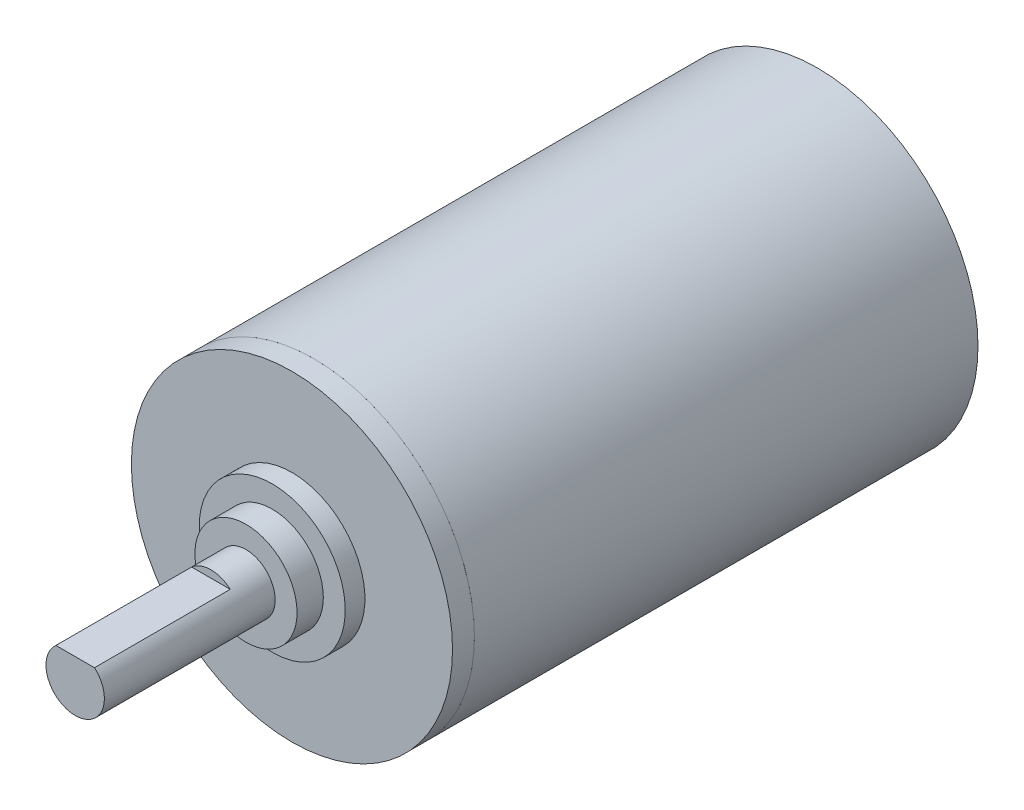
ISO-10303-21;
HEADER;
FILE_DESCRIPTION(('STEP AP214'),'2;1');
FILE_NAME('part.step','',(''),(''),'','','');
FILE_SCHEMA(('AUTOMOTIVE_DESIGN { 1 0 10303 214 1 1 1 1 }'));
ENDSEC;
DATA;
#1=APPLICATION_CONTEXT('core data for automotive mechanical design processes');
#2=APPLICATION_PROTOCOL_DEFINITION('international standard','automotive_design',2000,#1);
#3=PRODUCT_CONTEXT('',#1,'mechanical');
#4=PRODUCT('Part','Part','',(#3));
#5=PRODUCT_RELATED_PRODUCT_CATEGORY('part','',(#4));
#6=PRODUCT_DEFINITION_FORMATION('','',#4);
#7=PRODUCT_DEFINITION_CONTEXT('part definition',#1,'design');
#8=PRODUCT_DEFINITION('design','',#6,#7);
#9=PRODUCT_DEFINITION_SHAPE('','',#8);
#10=(LENGTH_UNIT() NAMED_UNIT(*) SI_UNIT(.MILLI.,.METRE.));
#11=(NAMED_UNIT(*) PLANE_ANGLE_UNIT() SI_UNIT($,.RADIAN.));
#12=(NAMED_UNIT(*) SI_UNIT($,.STERADIAN.) SOLID_ANGLE_UNIT());
#13=UNCERTAINTY_MEASURE_WITH_UNIT(LENGTH_MEASURE(1.E-05),#10,'distance_accuracy_value','');
#14=(GEOMETRIC_REPRESENTATION_CONTEXT(3) GLOBAL_UNCERTAINTY_ASSIGNED_CONTEXT((#13)) GLOBAL_UNIT_ASSIGNED_CONTEXT((#10,
#11,#12)) REPRESENTATION_CONTEXT('',''));
#15=CARTESIAN_POINT('',(0.,0.,0.));
#16=DIRECTION('',(0.,0.,1.));
#17=DIRECTION('',(1.,0.,0.));
#18=AXIS2_PLACEMENT_3D('',#15,#16,#17);
#19=CARTESIAN_POINT('',(0.,0.,14.85));
#20=DIRECTION('',(0.,0.,-1.));
#21=DIRECTION('',(-1.,0.,0.));
#22=AXIS2_PLACEMENT_3D('',#19,#20,#21);
#23=CYLINDRICAL_SURFACE('',#22,2.);
#24=CARTESIAN_POINT('',(0.,0.,3.15));
#25=DIRECTION('',(0.,0.,1.));
#26=DIRECTION('',(1.,0.,0.));
#27=AXIS2_PLACEMENT_3D('',#24,#25,#26);
#28=CIRCLE('',#27,2.);
#29=CARTESIAN_POINT('',(2.,0.,3.15));
#30=VERTEX_POINT('',#29);
#31=EDGE_CURVE('E89',#30,#30,#28,.T.);
#32=ORIENTED_EDGE('',*,*,#31,.T.);
#33=EDGE_LOOP('',(#32));
#34=FACE_BOUND('',#33,.T.);
#35=DIRECTION('',(0.,0.,1.));
#36=VECTOR('',#35,1.);
#37=CARTESIAN_POINT('',(1.3228756555323,1.5,5.55));
#38=LINE('',#37,#36);
#39=CARTESIAN_POINT('',(1.3228756555323,1.5,5.55));
#40=VERTEX_POINT('',#39);
#41=CARTESIAN_POINT('',(1.3228756555323,1.5,14.85));
#42=VERTEX_POINT('',#41);
#43=EDGE_CURVE('E64',#40,#42,#38,.T.);
#44=ORIENTED_EDGE('',*,*,#43,.T.);
#45=CARTESIAN_POINT('',(0.,0.,14.85));
#46=DIRECTION('',(0.,0.,1.));
#47=DIRECTION('',(1.,0.,0.));
#48=AXIS2_PLACEMENT_3D('',#45,#46,#47);
#49=CIRCLE('',#48,2.);
#50=CARTESIAN_POINT('',(-1.3228756555323,1.5,14.85));
#51=VERTEX_POINT('',#50);
#52=EDGE_CURVE('E72',#51,#42,#49,.T.);
#53=ORIENTED_EDGE('',*,*,#52,.F.);
#54=DIRECTION('',(0.,0.,1.));
#55=VECTOR('',#54,1.);
#56=CARTESIAN_POINT('',(-1.3228756555323,1.5,5.55));
#57=LINE('',#56,#55);
#58=CARTESIAN_POINT('',(-1.3228756555323,1.5,5.55));
#59=VERTEX_POINT('',#58);
#60=EDGE_CURVE('E51',#59,#51,#57,.T.);
#61=ORIENTED_EDGE('',*,*,#60,.F.);
#62=CARTESIAN_POINT('',(0.,0.,5.55));
#63=DIRECTION('',(0.,0.,1.));
#64=DIRECTION('',(1.,0.,0.));
#65=AXIS2_PLACEMENT_3D('',#62,#63,#64);
#66=CIRCLE('',#65,2.);
#67=EDGE_CURVE('E73',#40,#59,#66,.T.);
#68=ORIENTED_EDGE('',*,*,#67,.F.);
#69=EDGE_LOOP('',(#44,#53,#61,#68));
#70=FACE_BOUND('',#69,.T.);
#71=ADVANCED_FACE('F36',(#34,#70),#23,.T.);
#72=CARTESIAN_POINT('',(0.,-24.3414213562373,14.85));
#73=DIRECTION('',(0.,0.,1.));
#74=DIRECTION('',(1.,0.,0.));
#75=AXIS2_PLACEMENT_3D('',#72,#73,#74);
#76=PLANE('',#75);
#77=ORIENTED_EDGE('',*,*,#52,.T.);
#78=DIRECTION('',(-1.,0.,0.));
#79=VECTOR('',#78,1.);
#80=CARTESIAN_POINT('',(0.,1.5,14.85));
#81=LINE('',#80,#79);
#82=EDGE_CURVE('E61',#42,#51,#81,.T.);
#83=ORIENTED_EDGE('',*,*,#82,.T.);
#84=EDGE_LOOP('',(#77,#83));
#85=FACE_BOUND('',#84,.T.);
#86=ADVANCED_FACE('F75',(#85),#76,.T.);
#87=CARTESIAN_POINT('',(0.,-24.3414213562373,0.));
#88=DIRECTION('',(0.,0.,1.));
#89=DIRECTION('',(1.,0.,0.));
#90=AXIS2_PLACEMENT_3D('',#87,#88,#89);
#91=PLANE('',#90);
#92=CARTESIAN_POINT('',(0.,0.,0.));
#93=DIRECTION('',(0.,0.,1.));
#94=DIRECTION('',(1.,0.,0.));
#95=AXIS2_PLACEMENT_3D('',#92,#93,#94);
#96=CIRCLE('',#95,11.);
#97=CARTESIAN_POINT('',(11.,0.,0.));
#98=VERTEX_POINT('',#97);
#99=EDGE_CURVE('E40',#98,#98,#96,.T.);
#100=ORIENTED_EDGE('',*,*,#99,.T.);
#101=EDGE_LOOP('',(#100));
#102=FACE_BOUND('',#101,.T.);
#103=CARTESIAN_POINT('',(0.,0.,0.));
#104=DIRECTION('',(0.,0.,1.));
#105=DIRECTION('',(1.,0.,0.));
#106=AXIS2_PLACEMENT_3D('',#103,#104,#105);
#107=CIRCLE('',#106,5.);
#108=CARTESIAN_POINT('',(-5.,0.,0.));
#109=VERTEX_POINT('',#108);
#110=EDGE_CURVE('E97',#109,#109,#107,.T.);
#111=ORIENTED_EDGE('',*,*,#110,.F.);
#112=EDGE_LOOP('',(#111));
#113=FACE_BOUND('',#112,.T.);
#114=ADVANCED_FACE('F109',(#102,#113),#91,.T.);
#115=CARTESIAN_POINT('',(0.,0.,-36.));
#116=DIRECTION('',(0.,0.,1.));
#117=DIRECTION('',(1.,0.,0.));
#118=AXIS2_PLACEMENT_3D('',#115,#116,#117);
#119=CYLINDRICAL_SURFACE('',#118,11.);
#120=CARTESIAN_POINT('',(0.,0.,-1.5));
#121=DIRECTION('',(0.,0.,1.));
#122=DIRECTION('',(1.,0.,0.));
#123=AXIS2_PLACEMENT_3D('',#120,#121,#122);
#124=CIRCLE('',#123,11.);
#125=CARTESIAN_POINT('',(11.,0.,-1.5));
#126=VERTEX_POINT('',#125);
#127=EDGE_CURVE('E84',#126,#126,#124,.T.);
#128=ORIENTED_EDGE('',*,*,#127,.T.);
#129=EDGE_LOOP('',(#128));
#130=FACE_BOUND('',#129,.T.);
#131=ORIENTED_EDGE('',*,*,#99,.F.);
#132=EDGE_LOOP('',(#131));
#133=FACE_BOUND('',#132,.T.);
#134=ADVANCED_FACE('F38',(#130,#133),#119,.T.);
#135=CARTESIAN_POINT('',(0.,0.,1.35));
#136=DIRECTION('',(0.,0.,-1.));
#137=DIRECTION('',(-1.,0.,0.));
#138=AXIS2_PLACEMENT_3D('',#135,#136,#137);
#139=CYLINDRICAL_SURFACE('',#138,5.);
#140=CARTESIAN_POINT('',(0.,0.,1.35));
#141=DIRECTION('',(0.,0.,1.));
#142=DIRECTION('',(1.,0.,0.));
#143=AXIS2_PLACEMENT_3D('',#140,#141,#142);
#144=CIRCLE('',#143,5.);
#145=CARTESIAN_POINT('',(-5.,0.,1.35));
#146=VERTEX_POINT('',#145);
#147=EDGE_CURVE('E101',#146,#146,#144,.T.);
#148=CARTESIAN_POINT('',(-5.,0.,1.35));
#149=CARTESIAN_POINT('',(-5.,0.,1.3359375));
#150=CARTESIAN_POINT('',(-5.,0.,1.321875));
#151=CARTESIAN_POINT('',(-5.,0.,1.29375));
#152=CARTESIAN_POINT('',(-5.,0.,1.2796875));
#153=CARTESIAN_POINT('',(-5.,0.,1.2515625));
#154=CARTESIAN_POINT('',(-5.,0.,1.2375));
#155=CARTESIAN_POINT('',(-5.,0.,1.209375));
#156=CARTESIAN_POINT('',(-5.,0.,1.1953125));
#157=CARTESIAN_POINT('',(-5.,0.,1.1671875));
#158=CARTESIAN_POINT('',(-5.,0.,1.153125));
#159=CARTESIAN_POINT('',(-5.,0.,1.125));
#160=CARTESIAN_POINT('',(-5.,0.,1.1109375));
#161=CARTESIAN_POINT('',(-5.,0.,1.0828125));
#162=CARTESIAN_POINT('',(-5.,0.,1.06875));
#163=CARTESIAN_POINT('',(-5.,0.,1.040625));
#164=CARTESIAN_POINT('',(-5.,0.,1.0265625));
#165=CARTESIAN_POINT('',(-5.,0.,0.9984375));
#166=CARTESIAN_POINT('',(-5.,0.,0.984375));
#167=CARTESIAN_POINT('',(-5.,0.,0.95625));
#168=CARTESIAN_POINT('',(-5.,0.,0.9421875));
#169=CARTESIAN_POINT('',(-5.,0.,0.9140625));
#170=CARTESIAN_POINT('',(-5.,0.,0.9));
#171=CARTESIAN_POINT('',(-5.,0.,0.871875));
#172=CARTESIAN_POINT('',(-5.,0.,0.8578125));
#173=CARTESIAN_POINT('',(-5.,0.,0.8296875));
#174=CARTESIAN_POINT('',(-5.,0.,0.815625));
#175=CARTESIAN_POINT('',(-5.,0.,0.7875));
#176=CARTESIAN_POINT('',(-5.,0.,0.7734375));
#177=CARTESIAN_POINT('',(-5.,0.,0.7453125));
#178=CARTESIAN_POINT('',(-5.,0.,0.73125));
#179=CARTESIAN_POINT('',(-5.,0.,0.703125));
#180=CARTESIAN_POINT('',(-5.,0.,0.6890625));
#181=CARTESIAN_POINT('',(-5.,0.,0.6609375));
#182=CARTESIAN_POINT('',(-5.,0.,0.646875));
#183=CARTESIAN_POINT('',(-5.,0.,0.61875));
#184=CARTESIAN_POINT('',(-5.,0.,0.6046875));
#185=CARTESIAN_POINT('',(-5.,0.,0.5765625));
#186=CARTESIAN_POINT('',(-5.,0.,0.5625));
#187=CARTESIAN_POINT('',(-5.,0.,0.534375));
#188=CARTESIAN_POINT('',(-5.,0.,0.5203125));
#189=CARTESIAN_POINT('',(-5.,0.,0.4921875));
#190=CARTESIAN_POINT('',(-5.,0.,0.478125));
#191=CARTESIAN_POINT('',(-5.,0.,0.45));
#192=CARTESIAN_POINT('',(-5.,0.,0.4359375));
#193=CARTESIAN_POINT('',(-5.,0.,0.4078125));
#194=CARTESIAN_POINT('',(-5.,0.,0.39375));
#195=CARTESIAN_POINT('',(-5.,0.,0.365625));
#196=CARTESIAN_POINT('',(-5.,0.,0.3515625));
#197=CARTESIAN_POINT('',(-5.,0.,0.3234375));
#198=CARTESIAN_POINT('',(-5.,0.,0.309375));
#199=CARTESIAN_POINT('',(-5.,0.,0.28125));
#200=CARTESIAN_POINT('',(-5.,0.,0.2671875));
#201=CARTESIAN_POINT('',(-5.,0.,0.2390625));
#202=CARTESIAN_POINT('',(-5.,0.,0.225));
#203=CARTESIAN_POINT('',(-5.,0.,0.196875));
#204=CARTESIAN_POINT('',(-5.,0.,0.1828125));
#205=CARTESIAN_POINT('',(-5.,0.,0.1546875));
#206=CARTESIAN_POINT('',(-5.,0.,0.140625));
#207=CARTESIAN_POINT('',(-5.,0.,0.1125));
#208=CARTESIAN_POINT('',(-5.,0.,0.0984374999999998));
#209=CARTESIAN_POINT('',(-5.,0.,0.0703124999999998));
#210=CARTESIAN_POINT('',(-5.,0.,0.0562499999999999));
#211=CARTESIAN_POINT('',(-5.,0.,0.0281249999999999));
#212=CARTESIAN_POINT('',(-5.,0.,0.0140624999999998));
#213=CARTESIAN_POINT('',(-5.,0.,0.));
#214=B_SPLINE_CURVE_WITH_KNOTS('',3,(#148,#149,#150,#151,#152,#153,#154,#155,#156,#157,#158,
#159,#160,#161,#162,#163,#164,#165,#166,#167,#168,#169,#170,#171,#172,#173,#174,#175,#176,#177,
#178,#179,#180,#181,#182,#183,#184,#185,#186,#187,#188,#189,#190,#191,#192,#193,#194,#195,#196,
#197,#198,#199,#200,#201,#202,#203,#204,#205,#206,#207,#208,#209,#210,#211,#212,#213),
.UNSPECIFIED.,.F.,.F.,(4,2,2,2,2,2,2,2,2,2,2,2,2,2,2,2,2,2,2,2,2,2,2,2,2,2,2,2,2,2,2,2,4),(0.,
0.0421875000000001,0.084375,0.1265625,0.16875,0.2109375,0.253125,0.2953125,0.3375,0.3796875,
0.421875,0.4640625,0.50625,0.5484375,0.590625,0.6328125,0.675,0.7171875,0.759375,0.8015625,
0.84375,0.8859375,0.928125,0.9703125,1.0125,1.0546875,1.096875,1.1390625,1.18125,1.2234375,
1.265625,1.3078125,1.35),.UNSPECIFIED.);
#215=EDGE_CURVE('BSEAM107',#146,#109,#214,.T.);
#216=ORIENTED_EDGE('',*,*,#147,.F.);
#217=ORIENTED_EDGE('',*,*,#110,.T.);
#218=ORIENTED_EDGE('',*,*,#215,.T.);
#219=ORIENTED_EDGE('',*,*,#215,.F.);
#220=EDGE_LOOP('',(#216,#218,#217,#219));
#221=FACE_BOUND('',#220,.T.);
#222=ADVANCED_FACE('F107',(#221),#139,.T.);
#223=CARTESIAN_POINT('',(0.,-24.3414213562373,1.35));
#224=DIRECTION('',(0.,0.,1.));
#225=DIRECTION('',(1.,0.,0.));
#226=AXIS2_PLACEMENT_3D('',#223,#224,#225);
#227=PLANE('',#226);
#228=CARTESIAN_POINT('',(0.,0.,1.35));
#229=DIRECTION('',(0.,0.,1.));
#230=DIRECTION('',(1.,0.,0.));
#231=AXIS2_PLACEMENT_3D('',#228,#229,#230);
#232=CIRCLE('',#231,3.5);
#233=CARTESIAN_POINT('',(3.5,0.,1.35));
#234=VERTEX_POINT('',#233);
#235=EDGE_CURVE('E98',#234,#234,#232,.T.);
#236=ORIENTED_EDGE('',*,*,#235,.F.);
#237=EDGE_LOOP('',(#236));
#238=FACE_BOUND('',#237,.T.);
#239=ORIENTED_EDGE('',*,*,#147,.T.);
#240=EDGE_LOOP('',(#239));
#241=FACE_BOUND('',#240,.T.);
#242=ADVANCED_FACE('F148',(#238,#241),#227,.T.);
#243=CARTESIAN_POINT('',(0.,0.,3.15));
#244=DIRECTION('',(0.,0.,-1.));
#245=DIRECTION('',(-1.,0.,0.));
#246=AXIS2_PLACEMENT_3D('',#243,#244,#245);
#247=CYLINDRICAL_SURFACE('',#246,3.5);
#248=ORIENTED_EDGE('',*,*,#235,.T.);
#249=EDGE_LOOP('',(#248));
#250=FACE_BOUND('',#249,.T.);
#251=CARTESIAN_POINT('',(0.,0.,3.15));
#252=DIRECTION('',(0.,0.,1.));
#253=DIRECTION('',(1.,0.,0.));
#254=AXIS2_PLACEMENT_3D('',#251,#252,#253);
#255=CIRCLE('',#254,3.5);
#256=CARTESIAN_POINT('',(3.5,0.,3.15));
#257=VERTEX_POINT('',#256);
#258=EDGE_CURVE('E94',#257,#257,#255,.T.);
#259=ORIENTED_EDGE('',*,*,#258,.F.);
#260=EDGE_LOOP('',(#259));
#261=FACE_BOUND('',#260,.T.);
#262=ADVANCED_FACE('F144',(#250,#261),#247,.T.);
#263=CARTESIAN_POINT('',(0.,-24.3414213562373,3.15));
#264=DIRECTION('',(0.,0.,1.));
#265=DIRECTION('',(1.,0.,0.));
#266=AXIS2_PLACEMENT_3D('',#263,#264,#265);
#267=PLANE('',#266);
#268=ORIENTED_EDGE('',*,*,#31,.F.);
#269=EDGE_LOOP('',(#268));
#270=FACE_BOUND('',#269,.T.);
#271=ORIENTED_EDGE('',*,*,#258,.T.);
#272=EDGE_LOOP('',(#271));
#273=FACE_BOUND('',#272,.T.);
#274=ADVANCED_FACE('F137',(#270,#273),#267,.T.);
#275=CARTESIAN_POINT('',(0.,0.,-1.501));
#276=DIRECTION('',(0.,0.,1.));
#277=DIRECTION('',(1.,0.,0.));
#278=AXIS2_PLACEMENT_3D('',#275,#276,#277);
#279=PLANE('',#278);
#280=CARTESIAN_POINT('',(0.,0.,-1.501));
#281=DIRECTION('',(0.,0.,1.));
#282=DIRECTION('',(1.,0.,0.));
#283=AXIS2_PLACEMENT_3D('',#280,#281,#282);
#284=CIRCLE('',#283,10.5);
#285=CARTESIAN_POINT('',(10.5,0.,-1.501));
#286=VERTEX_POINT('',#285);
#287=EDGE_CURVE('E79',#286,#286,#284,.T.);
#288=ORIENTED_EDGE('',*,*,#287,.F.);
#289=EDGE_LOOP('',(#288));
#290=FACE_BOUND('',#289,.T.);
#291=CARTESIAN_POINT('',(0.,0.,-1.501));
#292=DIRECTION('',(0.,0.,1.));
#293=DIRECTION('',(1.,0.,0.));
#294=AXIS2_PLACEMENT_3D('',#291,#292,#293);
#295=CIRCLE('',#294,11.);
#296=CARTESIAN_POINT('',(11.,0.,-1.501));
#297=VERTEX_POINT('',#296);
#298=EDGE_CURVE('E86',#297,#297,#295,.T.);
#299=ORIENTED_EDGE('',*,*,#298,.T.);
#300=EDGE_LOOP('',(#299));
#301=FACE_BOUND('',#300,.T.);
#302=ADVANCED_FACE('F134',(#290,#301),#279,.T.);
#303=CARTESIAN_POINT('',(0.,0.,-1.5));
#304=DIRECTION('',(0.,0.,1.));
#305=DIRECTION('',(1.,0.,0.));
#306=AXIS2_PLACEMENT_3D('',#303,#304,#305);
#307=PLANE('',#306);
#308=CARTESIAN_POINT('',(0.,0.,-1.5));
#309=DIRECTION('',(0.,0.,1.));
#310=DIRECTION('',(1.,0.,0.));
#311=AXIS2_PLACEMENT_3D('',#308,#309,#310);
#312=CIRCLE('',#311,10.5);
#313=CARTESIAN_POINT('',(10.5,0.,-1.5));
#314=VERTEX_POINT('',#313);
#315=EDGE_CURVE('E76',#314,#314,#312,.T.);
#316=ORIENTED_EDGE('',*,*,#315,.T.);
#317=EDGE_LOOP('',(#316));
#318=FACE_BOUND('',#317,.T.);
#319=ORIENTED_EDGE('',*,*,#127,.F.);
#320=EDGE_LOOP('',(#319));
#321=FACE_BOUND('',#320,.T.);
#322=ADVANCED_FACE('F132',(#318,#321),#307,.F.);
#323=CARTESIAN_POINT('',(0.,0.,-1.501));
#324=DIRECTION('',(0.,0.,1.));
#325=DIRECTION('',(1.,0.,0.));
#326=AXIS2_PLACEMENT_3D('',#323,#324,#325);
#327=CYLINDRICAL_SURFACE('',#326,10.5);
#328=ORIENTED_EDGE('',*,*,#287,.T.);
#329=EDGE_LOOP('',(#328));
#330=FACE_BOUND('',#329,.T.);
#331=ORIENTED_EDGE('',*,*,#315,.F.);
#332=EDGE_LOOP('',(#331));
#333=FACE_BOUND('',#332,.T.);
#334=ADVANCED_FACE('F128',(#330,#333),#327,.T.);
#335=CARTESIAN_POINT('',(0.,-24.3414213562373,-36.));
#336=DIRECTION('',(0.,0.,1.));
#337=DIRECTION('',(1.,0.,0.));
#338=AXIS2_PLACEMENT_3D('',#335,#336,#337);
#339=PLANE('',#338);
#340=CARTESIAN_POINT('',(0.,0.,-36.));
#341=DIRECTION('',(0.,0.,-1.));
#342=DIRECTION('',(-1.,0.,0.));
#343=AXIS2_PLACEMENT_3D('',#340,#341,#342);
#344=CIRCLE('',#343,5.);
#345=CARTESIAN_POINT('',(-5.,0.,-36.));
#346=VERTEX_POINT('',#345);
#347=EDGE_CURVE('E164',#346,#346,#344,.T.);
#348=ORIENTED_EDGE('',*,*,#347,.F.);
#349=EDGE_LOOP('',(#348));
#350=FACE_BOUND('',#349,.T.);
#351=CARTESIAN_POINT('',(0.,0.,-36.));
#352=DIRECTION('',(0.,0.,1.));
#353=DIRECTION('',(1.,0.,0.));
#354=AXIS2_PLACEMENT_3D('',#351,#352,#353);
#355=CIRCLE('',#354,11.);
#356=CARTESIAN_POINT('',(11.,0.,-36.));
#357=VERTEX_POINT('',#356);
#358=EDGE_CURVE('E11',#357,#357,#355,.T.);
#359=ORIENTED_EDGE('',*,*,#358,.F.);
#360=EDGE_LOOP('',(#359));
#361=FACE_BOUND('',#360,.T.);
#362=ADVANCED_FACE('F131',(#350,#361),#339,.F.);
#363=ORIENTED_EDGE('',*,*,#358,.T.);
#364=EDGE_LOOP('',(#363));
#365=FACE_BOUND('',#364,.T.);
#366=ORIENTED_EDGE('',*,*,#298,.F.);
#367=EDGE_LOOP('',(#366));
#368=FACE_BOUND('',#367,.T.);
#369=ADVANCED_FACE('F117',(#365,#368),#119,.T.);
#370=CARTESIAN_POINT('',(0.,1.5,5.55));
#371=DIRECTION('',(0.,1.,0.));
#372=DIRECTION('',(0.,0.,1.));
#373=AXIS2_PLACEMENT_3D('',#370,#371,#372);
#374=PLANE('',#373);
#375=ORIENTED_EDGE('',*,*,#82,.F.);
#376=ORIENTED_EDGE('',*,*,#43,.F.);
#377=DIRECTION('',(-1.,0.,0.));
#378=VECTOR('',#377,1.);
#379=CARTESIAN_POINT('',(0.,1.5,5.55));
#380=LINE('',#379,#378);
#381=EDGE_CURVE('E57',#40,#59,#380,.T.);
#382=ORIENTED_EDGE('',*,*,#381,.T.);
#383=ORIENTED_EDGE('',*,*,#60,.T.);
#384=EDGE_LOOP('',(#375,#376,#382,#383));
#385=FACE_BOUND('',#384,.T.);
#386=ADVANCED_FACE('F63',(#385),#374,.T.);
#387=CARTESIAN_POINT('',(0.,-4.54142135623731,5.55));
#388=DIRECTION('',(0.,0.,1.));
#389=DIRECTION('',(1.,0.,0.));
#390=AXIS2_PLACEMENT_3D('',#387,#388,#389);
#391=PLANE('',#390);
#392=ORIENTED_EDGE('',*,*,#381,.F.);
#393=ORIENTED_EDGE('',*,*,#67,.T.);
#394=EDGE_LOOP('',(#392,#393));
#395=FACE_BOUND('',#394,.T.);
#396=ADVANCED_FACE('F180',(#395),#391,.T.);
#397=CARTESIAN_POINT('',(0.,0.,-35.));
#398=DIRECTION('',(0.,0.,-1.));
#399=DIRECTION('',(-1.,0.,0.));
#400=AXIS2_PLACEMENT_3D('',#397,#398,#399);
#401=CYLINDRICAL_SURFACE('',#400,5.);
#402=CARTESIAN_POINT('',(0.,0.,-35.));
#403=DIRECTION('',(0.,0.,-1.));
#404=DIRECTION('',(-1.,0.,0.));
#405=AXIS2_PLACEMENT_3D('',#402,#403,#404);
#406=CIRCLE('',#405,5.);
#407=CARTESIAN_POINT('',(-5.,0.,-35.));
#408=VERTEX_POINT('',#407);
#409=EDGE_CURVE('E68',#408,#408,#406,.T.);
#410=ORIENTED_EDGE('',*,*,#409,.F.);
#411=EDGE_LOOP('',(#410));
#412=FACE_BOUND('',#411,.T.);
#413=ORIENTED_EDGE('',*,*,#347,.T.);
#414=EDGE_LOOP('',(#413));
#415=FACE_BOUND('',#414,.T.);
#416=ADVANCED_FACE('F182',(#412,#415),#401,.F.);
#417=CARTESIAN_POINT('',(0.,0.,-35.));
#418=DIRECTION('',(0.,0.,-1.));
#419=DIRECTION('',(-1.,0.,0.));
#420=AXIS2_PLACEMENT_3D('',#417,#418,#419);
#421=PLANE('',#420);
#422=CARTESIAN_POINT('',(0.,0.,-35.));
#423=DIRECTION('',(0.,0.,-1.));
#424=DIRECTION('',(-1.,0.,0.));
#425=AXIS2_PLACEMENT_3D('',#422,#423,#424);
#426=CIRCLE('',#425,1.5);
#427=CARTESIAN_POINT('',(-1.5,0.,-35.));
#428=VERTEX_POINT('',#427);
#429=EDGE_CURVE('E170',#428,#428,#426,.T.);
#430=ORIENTED_EDGE('',*,*,#429,.F.);
#431=EDGE_LOOP('',(#430));
#432=FACE_BOUND('',#431,.T.);
#433=ORIENTED_EDGE('',*,*,#409,.T.);
#434=EDGE_LOOP('',(#433));
#435=FACE_BOUND('',#434,.T.);
#436=ADVANCED_FACE('F188',(#432,#435),#421,.T.);
#437=CARTESIAN_POINT('',(0.,0.,-25.7));
#438=DIRECTION('',(0.,0.,-1.));
#439=DIRECTION('',(-1.,0.,0.));
#440=AXIS2_PLACEMENT_3D('',#437,#438,#439);
#441=CYLINDRICAL_SURFACE('',#440,1.5);
#442=CARTESIAN_POINT('',(0.,0.,-25.7));
#443=DIRECTION('',(0.,0.,-1.));
#444=DIRECTION('',(-1.,0.,0.));
#445=AXIS2_PLACEMENT_3D('',#442,#443,#444);
#446=CIRCLE('',#445,1.5);
#447=CARTESIAN_POINT('',(-1.5,0.,-25.7));
#448=VERTEX_POINT('',#447);
#449=EDGE_CURVE('E175',#448,#448,#446,.T.);
#450=CARTESIAN_POINT('',(-1.5,0.,-35.));
#451=CARTESIAN_POINT('',(-1.5,0.,-34.903125));
#452=CARTESIAN_POINT('',(-1.5,0.,-34.80625));
#453=CARTESIAN_POINT('',(-1.5,0.,-34.6125));
#454=CARTESIAN_POINT('',(-1.5,0.,-34.515625));
#455=CARTESIAN_POINT('',(-1.5,0.,-34.321875));
#456=CARTESIAN_POINT('',(-1.5,0.,-34.225));
#457=CARTESIAN_POINT('',(-1.5,0.,-34.03125));
#458=CARTESIAN_POINT('',(-1.5,0.,-33.934375));
#459=CARTESIAN_POINT('',(-1.5,0.,-33.740625));
#460=CARTESIAN_POINT('',(-1.5,0.,-33.64375));
#461=CARTESIAN_POINT('',(-1.5,0.,-33.45));
#462=CARTESIAN_POINT('',(-1.5,0.,-33.353125));
#463=CARTESIAN_POINT('',(-1.5,0.,-33.159375));
#464=CARTESIAN_POINT('',(-1.5,0.,-33.0625));
#465=CARTESIAN_POINT('',(-1.5,0.,-32.86875));
#466=CARTESIAN_POINT('',(-1.5,0.,-32.771875));
#467=CARTESIAN_POINT('',(-1.5,0.,-32.578125));
#468=CARTESIAN_POINT('',(-1.5,0.,-32.48125));
#469=CARTESIAN_POINT('',(-1.5,0.,-32.2875));
#470=CARTESIAN_POINT('',(-1.5,0.,-32.190625));
#471=CARTESIAN_POINT('',(-1.5,0.,-31.996875));
#472=CARTESIAN_POINT('',(-1.5,0.,-31.9));
#473=CARTESIAN_POINT('',(-1.5,0.,-31.70625));
#474=CARTESIAN_POINT('',(-1.5,0.,-31.609375));
#475=CARTESIAN_POINT('',(-1.5,0.,-31.415625));
#476=CARTESIAN_POINT('',(-1.5,0.,-31.31875));
#477=CARTESIAN_POINT('',(-1.5,0.,-31.125));
#478=CARTESIAN_POINT('',(-1.5,0.,-31.028125));
#479=CARTESIAN_POINT('',(-1.5,0.,-30.834375));
#480=CARTESIAN_POINT('',(-1.5,0.,-30.7375));
#481=CARTESIAN_POINT('',(-1.5,0.,-30.54375));
#482=CARTESIAN_POINT('',(-1.5,0.,-30.446875));
#483=CARTESIAN_POINT('',(-1.5,0.,-30.253125));
#484=CARTESIAN_POINT('',(-1.5,0.,-30.15625));
#485=CARTESIAN_POINT('',(-1.5,0.,-29.9625));
#486=CARTESIAN_POINT('',(-1.5,0.,-29.865625));
#487=CARTESIAN_POINT('',(-1.5,0.,-29.671875));
#488=CARTESIAN_POINT('',(-1.5,0.,-29.575));
#489=CARTESIAN_POINT('',(-1.5,0.,-29.38125));
#490=CARTESIAN_POINT('',(-1.5,0.,-29.284375));
#491=CARTESIAN_POINT('',(-1.5,0.,-29.090625));
#492=CARTESIAN_POINT('',(-1.5,0.,-28.99375));
#493=CARTESIAN_POINT('',(-1.5,0.,-28.8));
#494=CARTESIAN_POINT('',(-1.5,0.,-28.703125));
#495=CARTESIAN_POINT('',(-1.5,0.,-28.509375));
#496=CARTESIAN_POINT('',(-1.5,0.,-28.4125));
#497=CARTESIAN_POINT('',(-1.5,0.,-28.21875));
#498=CARTESIAN_POINT('',(-1.5,0.,-28.121875));
#499=CARTESIAN_POINT('',(-1.5,0.,-27.928125));
#500=CARTESIAN_POINT('',(-1.5,0.,-27.83125));
#501=CARTESIAN_POINT('',(-1.5,0.,-27.6375));
#502=CARTESIAN_POINT('',(-1.5,0.,-27.540625));
#503=CARTESIAN_POINT('',(-1.5,0.,-27.346875));
#504=CARTESIAN_POINT('',(-1.5,0.,-27.25));
#505=CARTESIAN_POINT('',(-1.5,0.,-27.05625));
#506=CARTESIAN_POINT('',(-1.5,0.,-26.959375));
#507=CARTESIAN_POINT('',(-1.5,0.,-26.765625));
#508=CARTESIAN_POINT('',(-1.5,0.,-26.66875));
#509=CARTESIAN_POINT('',(-1.5,0.,-26.475));
#510=CARTESIAN_POINT('',(-1.5,0.,-26.378125));
#511=CARTESIAN_POINT('',(-1.5,0.,-26.184375));
#512=CARTESIAN_POINT('',(-1.5,0.,-26.0875));
#513=CARTESIAN_POINT('',(-1.5,0.,-25.89375));
#514=CARTESIAN_POINT('',(-1.5,0.,-25.796875));
#515=CARTESIAN_POINT('',(-1.5,0.,-25.7));
#516=B_SPLINE_CURVE_WITH_KNOTS('',3,(#450,#451,#452,#453,#454,#455,#456,#457,#458,#459,#460,
#461,#462,#463,#464,#465,#466,#467,#468,#469,#470,#471,#472,#473,#474,#475,#476,#477,#478,#479,
#480,#481,#482,#483,#484,#485,#486,#487,#488,#489,#490,#491,#492,#493,#494,#495,#496,#497,#498,
#499,#500,#501,#502,#503,#504,#505,#506,#507,#508,#509,#510,#511,#512,#513,#514,#515),
.UNSPECIFIED.,.F.,.F.,(4,2,2,2,2,2,2,2,2,2,2,2,2,2,2,2,2,2,2,2,2,2,2,2,2,2,2,2,2,2,2,2,4),(0.,
0.290625000000003,0.581249999999998,0.871875000000001,1.1625,1.453125,1.74375,2.034375,2.325,
2.615625,2.90625,3.196875,3.4875,3.778125,4.06875,4.359375,4.65,4.940625,5.23125,5.521875,
5.8125,6.103125,6.39375,6.684375,6.975,7.265625,7.55625,7.846875,8.1375,8.428125,8.71875,
9.009375,9.3),.UNSPECIFIED.);
#517=EDGE_CURVE('BSEAM194',#428,#448,#516,.T.);
#518=ORIENTED_EDGE('',*,*,#429,.T.);
#519=ORIENTED_EDGE('',*,*,#449,.F.);
#520=ORIENTED_EDGE('',*,*,#517,.T.);
#521=ORIENTED_EDGE('',*,*,#517,.F.);
#522=EDGE_LOOP('',(#518,#520,#519,#521));
#523=FACE_BOUND('',#522,.T.);
#524=ADVANCED_FACE('F194',(#523),#441,.F.);
#525=CARTESIAN_POINT('',(-24.3414213562373,0.,-25.7));
#526=DIRECTION('',(0.,0.,-1.));
#527=DIRECTION('',(-1.,0.,0.));
#528=AXIS2_PLACEMENT_3D('',#525,#526,#527);
#529=PLANE('',#528);
#530=ORIENTED_EDGE('',*,*,#449,.T.);
#531=EDGE_LOOP('',(#530));
#532=FACE_BOUND('',#531,.T.);
#533=ADVANCED_FACE('F198',(#532),#529,.T.);
#534=CLOSED_SHELL('',(#71,#86,#114,#134,#222,#242,#262,#274,#302,#322,#334,#362,#369,#386,#396,
#416,#436,#524,#533));
#535=MANIFOLD_SOLID_BREP('B2',#534);
#536=ADVANCED_BREP_SHAPE_REPRESENTATION('',(#18,#535),#14);
#537=SHAPE_DEFINITION_REPRESENTATION(#9,#536);
ENDSEC;
END-ISO-10303-21;
